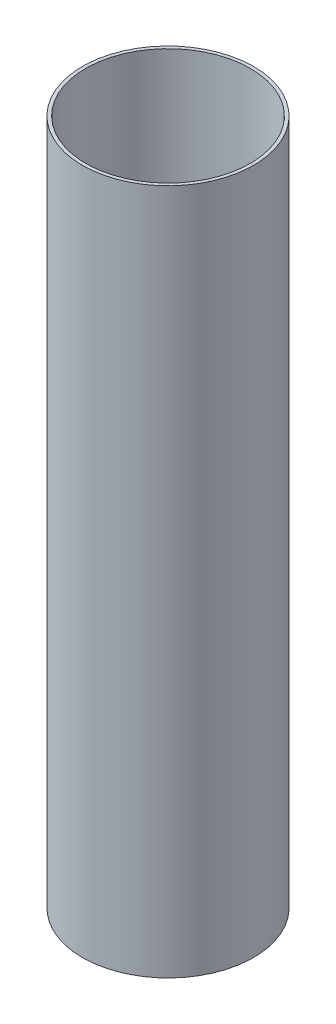
ISO-10303-21;
HEADER;
FILE_DESCRIPTION(('STEP AP214'),'2;1');
FILE_NAME('part.step','',(''),(''),'','','');
FILE_SCHEMA(('AUTOMOTIVE_DESIGN { 1 0 10303 214 1 1 1 1 }'));
ENDSEC;
DATA;
#1=APPLICATION_CONTEXT('core data for automotive mechanical design processes');
#2=APPLICATION_PROTOCOL_DEFINITION('international standard','automotive_design',2000,#1);
#3=PRODUCT_CONTEXT('',#1,'mechanical');
#4=PRODUCT('Part','Part','',(#3));
#5=PRODUCT_RELATED_PRODUCT_CATEGORY('part','',(#4));
#6=PRODUCT_DEFINITION_FORMATION('','',#4);
#7=PRODUCT_DEFINITION_CONTEXT('part definition',#1,'design');
#8=PRODUCT_DEFINITION('design','',#6,#7);
#9=PRODUCT_DEFINITION_SHAPE('','',#8);
#10=(LENGTH_UNIT() NAMED_UNIT(*) SI_UNIT(.MILLI.,.METRE.));
#11=(NAMED_UNIT(*) PLANE_ANGLE_UNIT() SI_UNIT($,.RADIAN.));
#12=(NAMED_UNIT(*) SI_UNIT($,.STERADIAN.) SOLID_ANGLE_UNIT());
#13=UNCERTAINTY_MEASURE_WITH_UNIT(LENGTH_MEASURE(1.E-05),#10,'distance_accuracy_value','');
#14=(GEOMETRIC_REPRESENTATION_CONTEXT(3) GLOBAL_UNCERTAINTY_ASSIGNED_CONTEXT((#13)) GLOBAL_UNIT_ASSIGNED_CONTEXT((#10,
#11,#12)) REPRESENTATION_CONTEXT('',''));
#15=CARTESIAN_POINT('',(0.,0.,0.));
#16=DIRECTION('',(0.,0.,1.));
#17=DIRECTION('',(1.,0.,0.));
#18=AXIS2_PLACEMENT_3D('',#15,#16,#17);
#19=CARTESIAN_POINT('',(0.,317.5,0.));
#20=DIRECTION('',(0.,1.,0.));
#21=DIRECTION('',(0.,0.,1.));
#22=AXIS2_PLACEMENT_3D('',#19,#20,#21);
#23=PLANE('',#22);
#24=CARTESIAN_POINT('',(0.,317.5,0.));
#25=DIRECTION('',(0.,1.,0.));
#26=DIRECTION('',(0.,0.,1.));
#27=AXIS2_PLACEMENT_3D('',#24,#25,#26);
#28=CIRCLE('',#27,39.624);
#29=CARTESIAN_POINT('',(0.,317.5,-39.624));
#30=VERTEX_POINT('',#29);
#31=EDGE_CURVE('E10',#30,#30,#28,.T.);
#32=ORIENTED_EDGE('',*,*,#31,.T.);
#33=EDGE_LOOP('',(#32));
#34=FACE_BOUND('',#33,.T.);
#35=CARTESIAN_POINT('',(0.,317.5,0.));
#36=DIRECTION('',(0.,1.,0.));
#37=DIRECTION('',(0.,0.,1.));
#38=AXIS2_PLACEMENT_3D('',#35,#36,#37);
#39=CIRCLE('',#38,38.1);
#40=CARTESIAN_POINT('',(0.,317.5,-38.1));
#41=VERTEX_POINT('',#40);
#42=EDGE_CURVE('E50',#41,#41,#39,.T.);
#43=ORIENTED_EDGE('',*,*,#42,.F.);
#44=EDGE_LOOP('',(#43));
#45=FACE_BOUND('',#44,.T.);
#46=ADVANCED_FACE('F37',(#34,#45),#23,.T.);
#47=CARTESIAN_POINT('',(0.,0.,0.));
#48=DIRECTION('',(0.,1.,0.));
#49=DIRECTION('',(0.,0.,1.));
#50=AXIS2_PLACEMENT_3D('',#47,#48,#49);
#51=PLANE('',#50);
#52=CARTESIAN_POINT('',(0.,0.,0.));
#53=DIRECTION('',(0.,1.,0.));
#54=DIRECTION('',(0.,0.,1.));
#55=AXIS2_PLACEMENT_3D('',#52,#53,#54);
#56=CIRCLE('',#55,39.624);
#57=CARTESIAN_POINT('',(0.,0.,-39.624));
#58=VERTEX_POINT('',#57);
#59=EDGE_CURVE('E41',#58,#58,#56,.T.);
#60=ORIENTED_EDGE('',*,*,#59,.F.);
#61=EDGE_LOOP('',(#60));
#62=FACE_BOUND('',#61,.T.);
#63=CARTESIAN_POINT('',(0.,0.,0.));
#64=DIRECTION('',(0.,1.,0.));
#65=DIRECTION('',(0.,0.,1.));
#66=AXIS2_PLACEMENT_3D('',#63,#64,#65);
#67=CIRCLE('',#66,38.1);
#68=CARTESIAN_POINT('',(0.,0.,-38.1));
#69=VERTEX_POINT('',#68);
#70=EDGE_CURVE('E52',#69,#69,#67,.T.);
#71=ORIENTED_EDGE('',*,*,#70,.T.);
#72=EDGE_LOOP('',(#71));
#73=FACE_BOUND('',#72,.T.);
#74=ADVANCED_FACE('F64',(#62,#73),#51,.F.);
#75=CARTESIAN_POINT('',(0.,317.5,0.));
#76=DIRECTION('',(0.,-1.,0.));
#77=DIRECTION('',(0.,0.,-1.));
#78=AXIS2_PLACEMENT_3D('',#75,#76,#77);
#79=CYLINDRICAL_SURFACE('',#78,39.624);
#80=CARTESIAN_POINT('',(0.,317.5,-39.624));
#81=CARTESIAN_POINT('',(0.,314.192708333333,-39.624));
#82=CARTESIAN_POINT('',(0.,310.885416666667,-39.624));
#83=CARTESIAN_POINT('',(0.,304.270833333333,-39.624));
#84=CARTESIAN_POINT('',(0.,300.963541666667,-39.624));
#85=CARTESIAN_POINT('',(0.,294.348958333333,-39.624));
#86=CARTESIAN_POINT('',(0.,291.041666666667,-39.624));
#87=CARTESIAN_POINT('',(0.,284.427083333333,-39.624));
#88=CARTESIAN_POINT('',(0.,281.119791666667,-39.624));
#89=CARTESIAN_POINT('',(0.,274.505208333333,-39.624));
#90=CARTESIAN_POINT('',(0.,271.197916666667,-39.624));
#91=CARTESIAN_POINT('',(0.,264.583333333333,-39.624));
#92=CARTESIAN_POINT('',(0.,261.276041666667,-39.624));
#93=CARTESIAN_POINT('',(0.,254.661458333333,-39.624));
#94=CARTESIAN_POINT('',(0.,251.354166666667,-39.624));
#95=CARTESIAN_POINT('',(0.,244.739583333333,-39.624));
#96=CARTESIAN_POINT('',(0.,241.432291666667,-39.624));
#97=CARTESIAN_POINT('',(0.,234.817708333333,-39.624));
#98=CARTESIAN_POINT('',(0.,231.510416666667,-39.624));
#99=CARTESIAN_POINT('',(0.,224.895833333333,-39.624));
#100=CARTESIAN_POINT('',(0.,221.588541666667,-39.624));
#101=CARTESIAN_POINT('',(0.,214.973958333333,-39.624));
#102=CARTESIAN_POINT('',(0.,211.666666666667,-39.624));
#103=CARTESIAN_POINT('',(0.,205.052083333333,-39.624));
#104=CARTESIAN_POINT('',(0.,201.744791666667,-39.624));
#105=CARTESIAN_POINT('',(0.,195.130208333333,-39.624));
#106=CARTESIAN_POINT('',(0.,191.822916666667,-39.624));
#107=CARTESIAN_POINT('',(0.,185.208333333333,-39.624));
#108=CARTESIAN_POINT('',(0.,181.901041666667,-39.624));
#109=CARTESIAN_POINT('',(0.,175.286458333333,-39.624));
#110=CARTESIAN_POINT('',(0.,171.979166666667,-39.624));
#111=CARTESIAN_POINT('',(0.,165.364583333333,-39.624));
#112=CARTESIAN_POINT('',(0.,162.057291666667,-39.624));
#113=CARTESIAN_POINT('',(0.,155.442708333333,-39.624));
#114=CARTESIAN_POINT('',(0.,152.135416666667,-39.624));
#115=CARTESIAN_POINT('',(0.,145.520833333333,-39.624));
#116=CARTESIAN_POINT('',(0.,142.213541666667,-39.624));
#117=CARTESIAN_POINT('',(0.,135.598958333333,-39.624));
#118=CARTESIAN_POINT('',(0.,132.291666666667,-39.624));
#119=CARTESIAN_POINT('',(0.,125.677083333333,-39.624));
#120=CARTESIAN_POINT('',(0.,122.369791666667,-39.624));
#121=CARTESIAN_POINT('',(0.,115.755208333333,-39.624));
#122=CARTESIAN_POINT('',(0.,112.447916666667,-39.624));
#123=CARTESIAN_POINT('',(0.,105.833333333333,-39.624));
#124=CARTESIAN_POINT('',(0.,102.526041666667,-39.624));
#125=CARTESIAN_POINT('',(0.,95.9114583333333,-39.624));
#126=CARTESIAN_POINT('',(0.,92.6041666666666,-39.624));
#127=CARTESIAN_POINT('',(0.,85.9895833333333,-39.624));
#128=CARTESIAN_POINT('',(0.,82.6822916666666,-39.624));
#129=CARTESIAN_POINT('',(0.,76.0677083333333,-39.624));
#130=CARTESIAN_POINT('',(0.,72.7604166666666,-39.624));
#131=CARTESIAN_POINT('',(0.,66.1458333333333,-39.624));
#132=CARTESIAN_POINT('',(0.,62.8385416666666,-39.624));
#133=CARTESIAN_POINT('',(0.,56.2239583333333,-39.624));
#134=CARTESIAN_POINT('',(0.,52.9166666666666,-39.624));
#135=CARTESIAN_POINT('',(0.,46.3020833333333,-39.624));
#136=CARTESIAN_POINT('',(0.,42.9947916666666,-39.624));
#137=CARTESIAN_POINT('',(0.,36.3802083333333,-39.624));
#138=CARTESIAN_POINT('',(0.,33.0729166666666,-39.624));
#139=CARTESIAN_POINT('',(0.,26.4583333333333,-39.624));
#140=CARTESIAN_POINT('',(0.,23.1510416666666,-39.624));
#141=CARTESIAN_POINT('',(0.,16.5364583333333,-39.624));
#142=CARTESIAN_POINT('',(0.,13.2291666666666,-39.624));
#143=CARTESIAN_POINT('',(0.,6.61458333333329,-39.624));
#144=CARTESIAN_POINT('',(0.,3.30729166666662,-39.624));
#145=CARTESIAN_POINT('',(0.,0.,-39.624));
#146=B_SPLINE_CURVE_WITH_KNOTS('',3,(#80,#81,#82,#83,#84,#85,#86,#87,#88,#89,#90,#91,#92,#93,
#94,#95,#96,#97,#98,#99,#100,#101,#102,#103,#104,#105,#106,#107,#108,#109,#110,#111,#112,#113,
#114,#115,#116,#117,#118,#119,#120,#121,#122,#123,#124,#125,#126,#127,#128,#129,#130,#131,#132,
#133,#134,#135,#136,#137,#138,#139,#140,#141,#142,#143,#144,#145),.UNSPECIFIED.,.F.,.F.,(4,2,2,
2,2,2,2,2,2,2,2,2,2,2,2,2,2,2,2,2,2,2,2,2,2,2,2,2,2,2,2,2,4),(0.,9.92187499999997,19.84375,
29.765625,39.6875,49.609375,59.53125,69.453125,79.375,89.296875,99.21875,109.140625,119.0625,
128.984375,138.90625,148.828125,158.75,168.671875,178.59375,188.515625,198.4375,208.359375,
218.28125,228.203125,238.125,248.046875,257.96875,267.890625,277.8125,287.734375,297.65625,
307.578125,317.5),.UNSPECIFIED.);
#147=EDGE_CURVE('BSEAM39',#30,#58,#146,.T.);
#148=ORIENTED_EDGE('',*,*,#31,.F.);
#149=ORIENTED_EDGE('',*,*,#59,.T.);
#150=ORIENTED_EDGE('',*,*,#147,.T.);
#151=ORIENTED_EDGE('',*,*,#147,.F.);
#152=EDGE_LOOP('',(#148,#150,#149,#151));
#153=FACE_BOUND('',#152,.T.);
#154=ADVANCED_FACE('F39',(#153),#79,.T.);
#155=CARTESIAN_POINT('',(0.,317.5,0.));
#156=DIRECTION('',(0.,-1.,0.));
#157=DIRECTION('',(0.,0.,-1.));
#158=AXIS2_PLACEMENT_3D('',#155,#156,#157);
#159=CYLINDRICAL_SURFACE('',#158,38.1);
#160=CARTESIAN_POINT('',(0.,317.5,-38.1));
#161=CARTESIAN_POINT('',(0.,314.192708333333,-38.1));
#162=CARTESIAN_POINT('',(0.,310.885416666667,-38.1));
#163=CARTESIAN_POINT('',(0.,304.270833333333,-38.1));
#164=CARTESIAN_POINT('',(0.,300.963541666667,-38.1));
#165=CARTESIAN_POINT('',(0.,294.348958333333,-38.1));
#166=CARTESIAN_POINT('',(0.,291.041666666667,-38.1));
#167=CARTESIAN_POINT('',(0.,284.427083333333,-38.1));
#168=CARTESIAN_POINT('',(0.,281.119791666667,-38.1));
#169=CARTESIAN_POINT('',(0.,274.505208333333,-38.1));
#170=CARTESIAN_POINT('',(0.,271.197916666667,-38.1));
#171=CARTESIAN_POINT('',(0.,264.583333333333,-38.1));
#172=CARTESIAN_POINT('',(0.,261.276041666667,-38.1));
#173=CARTESIAN_POINT('',(0.,254.661458333333,-38.1));
#174=CARTESIAN_POINT('',(0.,251.354166666667,-38.1));
#175=CARTESIAN_POINT('',(0.,244.739583333333,-38.1));
#176=CARTESIAN_POINT('',(0.,241.432291666667,-38.1));
#177=CARTESIAN_POINT('',(0.,234.817708333333,-38.1));
#178=CARTESIAN_POINT('',(0.,231.510416666667,-38.1));
#179=CARTESIAN_POINT('',(0.,224.895833333333,-38.1));
#180=CARTESIAN_POINT('',(0.,221.588541666667,-38.1));
#181=CARTESIAN_POINT('',(0.,214.973958333333,-38.1));
#182=CARTESIAN_POINT('',(0.,211.666666666667,-38.1));
#183=CARTESIAN_POINT('',(0.,205.052083333333,-38.1));
#184=CARTESIAN_POINT('',(0.,201.744791666667,-38.1));
#185=CARTESIAN_POINT('',(0.,195.130208333333,-38.1));
#186=CARTESIAN_POINT('',(0.,191.822916666667,-38.1));
#187=CARTESIAN_POINT('',(0.,185.208333333333,-38.1));
#188=CARTESIAN_POINT('',(0.,181.901041666667,-38.1));
#189=CARTESIAN_POINT('',(0.,175.286458333333,-38.1));
#190=CARTESIAN_POINT('',(0.,171.979166666667,-38.1));
#191=CARTESIAN_POINT('',(0.,165.364583333333,-38.1));
#192=CARTESIAN_POINT('',(0.,162.057291666667,-38.1));
#193=CARTESIAN_POINT('',(0.,155.442708333333,-38.1));
#194=CARTESIAN_POINT('',(0.,152.135416666667,-38.1));
#195=CARTESIAN_POINT('',(0.,145.520833333333,-38.1));
#196=CARTESIAN_POINT('',(0.,142.213541666667,-38.1));
#197=CARTESIAN_POINT('',(0.,135.598958333333,-38.1));
#198=CARTESIAN_POINT('',(0.,132.291666666667,-38.1));
#199=CARTESIAN_POINT('',(0.,125.677083333333,-38.1));
#200=CARTESIAN_POINT('',(0.,122.369791666667,-38.1));
#201=CARTESIAN_POINT('',(0.,115.755208333333,-38.1));
#202=CARTESIAN_POINT('',(0.,112.447916666667,-38.1));
#203=CARTESIAN_POINT('',(0.,105.833333333333,-38.1));
#204=CARTESIAN_POINT('',(0.,102.526041666667,-38.1));
#205=CARTESIAN_POINT('',(0.,95.9114583333332,-38.1));
#206=CARTESIAN_POINT('',(0.,92.6041666666666,-38.1));
#207=CARTESIAN_POINT('',(0.,85.9895833333332,-38.1));
#208=CARTESIAN_POINT('',(0.,82.6822916666666,-38.1));
#209=CARTESIAN_POINT('',(0.,76.0677083333332,-38.1));
#210=CARTESIAN_POINT('',(0.,72.7604166666666,-38.1));
#211=CARTESIAN_POINT('',(0.,66.1458333333333,-38.1));
#212=CARTESIAN_POINT('',(0.,62.8385416666666,-38.1));
#213=CARTESIAN_POINT('',(0.,56.2239583333333,-38.1));
#214=CARTESIAN_POINT('',(0.,52.9166666666666,-38.1));
#215=CARTESIAN_POINT('',(0.,46.3020833333333,-38.1));
#216=CARTESIAN_POINT('',(0.,42.9947916666666,-38.1));
#217=CARTESIAN_POINT('',(0.,36.3802083333333,-38.1));
#218=CARTESIAN_POINT('',(0.,33.0729166666666,-38.1));
#219=CARTESIAN_POINT('',(0.,26.4583333333333,-38.1));
#220=CARTESIAN_POINT('',(0.,23.1510416666666,-38.1));
#221=CARTESIAN_POINT('',(0.,16.5364583333333,-38.1));
#222=CARTESIAN_POINT('',(0.,13.2291666666666,-38.1));
#223=CARTESIAN_POINT('',(0.,6.61458333333329,-38.1));
#224=CARTESIAN_POINT('',(0.,3.30729166666662,-38.1));
#225=CARTESIAN_POINT('',(0.,0.,-38.1));
#226=B_SPLINE_CURVE_WITH_KNOTS('',3,(#160,#161,#162,#163,#164,#165,#166,#167,#168,#169,#170,
#171,#172,#173,#174,#175,#176,#177,#178,#179,#180,#181,#182,#183,#184,#185,#186,#187,#188,#189,
#190,#191,#192,#193,#194,#195,#196,#197,#198,#199,#200,#201,#202,#203,#204,#205,#206,#207,#208,
#209,#210,#211,#212,#213,#214,#215,#216,#217,#218,#219,#220,#221,#222,#223,#224,#225),
.UNSPECIFIED.,.F.,.F.,(4,2,2,2,2,2,2,2,2,2,2,2,2,2,2,2,2,2,2,2,2,2,2,2,2,2,2,2,2,2,2,2,4),(0.,
9.92187500000002,19.84375,29.765625,39.6875,49.6093750000001,59.53125,69.4531250000001,79.375,
89.2968750000001,99.2187500000001,109.140625,119.0625,128.984375,138.90625,148.828125,158.75,
168.671875,178.59375,188.515625,198.4375,208.359375,218.28125,228.203125,238.125,248.046875,
257.96875,267.890625,277.8125,287.734375,297.65625,307.578125,317.5),.UNSPECIFIED.);
#227=EDGE_CURVE('BSEAM60',#41,#69,#226,.T.);
#228=ORIENTED_EDGE('',*,*,#42,.T.);
#229=ORIENTED_EDGE('',*,*,#70,.F.);
#230=ORIENTED_EDGE('',*,*,#227,.T.);
#231=ORIENTED_EDGE('',*,*,#227,.F.);
#232=EDGE_LOOP('',(#228,#230,#229,#231));
#233=FACE_BOUND('',#232,.T.);
#234=ADVANCED_FACE('F60',(#233),#159,.F.);
#235=CLOSED_SHELL('',(#46,#74,#154,#234));
#236=MANIFOLD_SOLID_BREP('B2',#235);
#237=ADVANCED_BREP_SHAPE_REPRESENTATION('',(#18,#236),#14);
#238=SHAPE_DEFINITION_REPRESENTATION(#9,#237);
ENDSEC;
END-ISO-10303-21;
